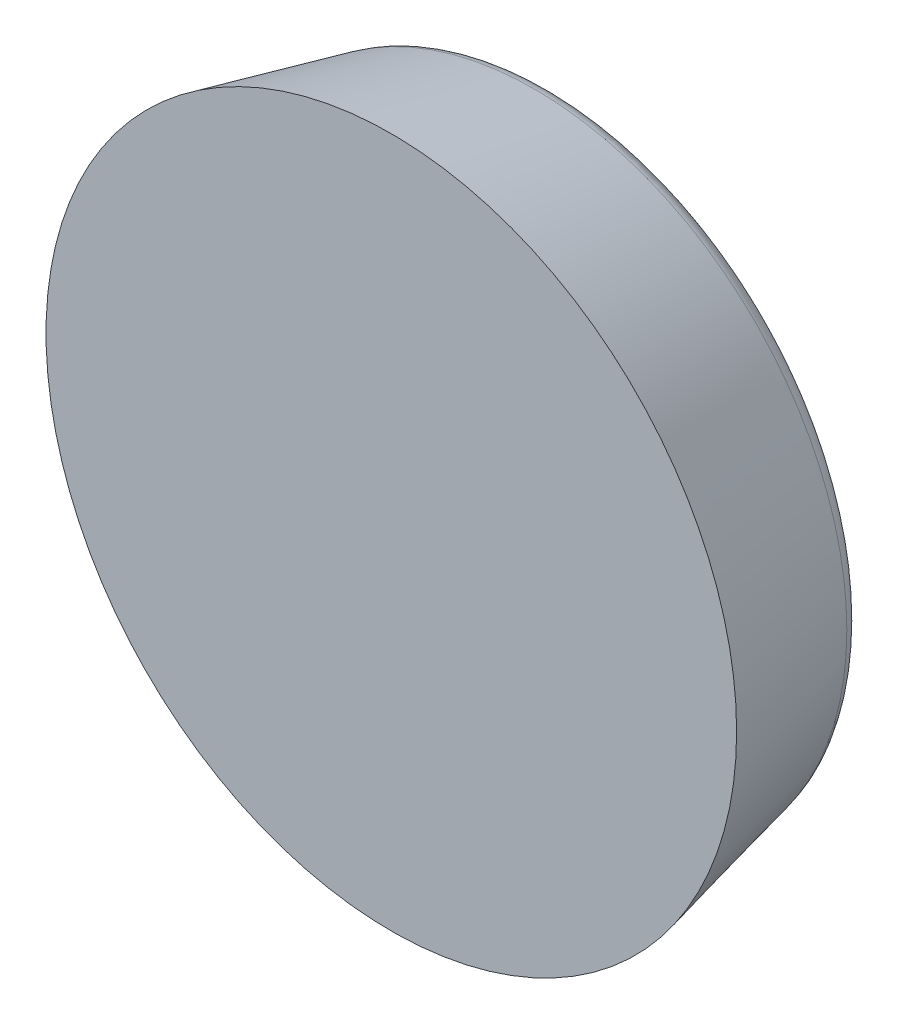
ISO-10303-21;
HEADER;
FILE_DESCRIPTION(('STEP AP214'),'2;1');
FILE_NAME('part.step','',(''),(''),'','','');
FILE_SCHEMA(('AUTOMOTIVE_DESIGN { 1 0 10303 214 1 1 1 1 }'));
ENDSEC;
DATA;
#1=APPLICATION_CONTEXT('core data for automotive mechanical design processes');
#2=APPLICATION_PROTOCOL_DEFINITION('international standard','automotive_design',2000,#1);
#3=PRODUCT_CONTEXT('',#1,'mechanical');
#4=PRODUCT('Part','Part','',(#3));
#5=PRODUCT_RELATED_PRODUCT_CATEGORY('part','',(#4));
#6=PRODUCT_DEFINITION_FORMATION('','',#4);
#7=PRODUCT_DEFINITION_CONTEXT('part definition',#1,'design');
#8=PRODUCT_DEFINITION('design','',#6,#7);
#9=PRODUCT_DEFINITION_SHAPE('','',#8);
#10=(LENGTH_UNIT() NAMED_UNIT(*) SI_UNIT(.MILLI.,.METRE.));
#11=(NAMED_UNIT(*) PLANE_ANGLE_UNIT() SI_UNIT($,.RADIAN.));
#12=(NAMED_UNIT(*) SI_UNIT($,.STERADIAN.) SOLID_ANGLE_UNIT());
#13=UNCERTAINTY_MEASURE_WITH_UNIT(LENGTH_MEASURE(1.E-05),#10,'distance_accuracy_value','');
#14=(GEOMETRIC_REPRESENTATION_CONTEXT(3) GLOBAL_UNCERTAINTY_ASSIGNED_CONTEXT((#13)) GLOBAL_UNIT_ASSIGNED_CONTEXT((#10,
#11,#12)) REPRESENTATION_CONTEXT('',''));
#15=CARTESIAN_POINT('',(0.,0.,0.));
#16=DIRECTION('',(0.,0.,1.));
#17=DIRECTION('',(1.,0.,0.));
#18=AXIS2_PLACEMENT_3D('',#15,#16,#17);
#19=CARTESIAN_POINT('',(0.,0.,0.));
#20=DIRECTION('',(0.,0.,1.));
#21=DIRECTION('',(1.,0.,0.));
#22=AXIS2_PLACEMENT_3D('',#19,#20,#21);
#23=CONICAL_SURFACE('',#22,15.,0.226892802759263);
#24=CARTESIAN_POINT('',(0.,0.,-6.22495105434387));
#25=DIRECTION('',(0.,0.,1.));
#26=DIRECTION('',(1.,0.,0.));
#27=AXIS2_PLACEMENT_3D('',#24,#25,#26);
#28=CIRCLE('',#27,13.5628568102385);
#29=CARTESIAN_POINT('',(13.5628568102385,0.,-6.22495105434387));
#30=VERTEX_POINT('',#29);
#31=EDGE_CURVE('E75',#30,#30,#28,.T.);
#32=ORIENTED_EDGE('',*,*,#31,.T.);
#33=EDGE_LOOP('',(#32));
#34=FACE_BOUND('',#33,.T.);
#35=CARTESIAN_POINT('',(0.,0.,0.));
#36=DIRECTION('',(0.,0.,1.));
#37=DIRECTION('',(1.,0.,0.));
#38=AXIS2_PLACEMENT_3D('',#35,#36,#37);
#39=CIRCLE('',#38,15.);
#40=CARTESIAN_POINT('',(15.,0.,0.));
#41=VERTEX_POINT('',#40);
#42=EDGE_CURVE('E226',#41,#41,#39,.T.);
#43=ORIENTED_EDGE('',*,*,#42,.F.);
#44=EDGE_LOOP('',(#43));
#45=FACE_BOUND('',#44,.T.);
#46=ADVANCED_FACE('F66',(#34,#45),#23,.T.);
#47=CARTESIAN_POINT('',(0.,0.,-7.));
#48=DIRECTION('',(0.,0.,1.));
#49=DIRECTION('',(1.,0.,0.));
#50=AXIS2_PLACEMENT_3D('',#47,#48,#49);
#51=PLANE('',#50);
#52=CARTESIAN_POINT('',(0.,0.,-7.));
#53=DIRECTION('',(0.,0.,1.));
#54=DIRECTION('',(1.,0.,0.));
#55=AXIS2_PLACEMENT_3D('',#52,#53,#54);
#56=CIRCLE('',#55,12.5884867454532);
#57=CARTESIAN_POINT('',(12.5884867454532,0.,-7.));
#58=VERTEX_POINT('',#57);
#59=EDGE_CURVE('E12',#58,#58,#56,.F.);
#60=ORIENTED_EDGE('',*,*,#59,.T.);
#61=EDGE_LOOP('',(#60));
#62=FACE_BOUND('',#61,.T.);
#63=CARTESIAN_POINT('',(0.,0.,-7.));
#64=DIRECTION('',(0.,0.,1.));
#65=DIRECTION('',(1.,0.,0.));
#66=AXIS2_PLACEMENT_3D('',#63,#64,#65);
#67=CIRCLE('',#66,11.);
#68=CARTESIAN_POINT('',(11.,0.,-7.));
#69=VERTEX_POINT('',#68);
#70=EDGE_CURVE('E234',#69,#69,#67,.T.);
#71=ORIENTED_EDGE('',*,*,#70,.T.);
#72=EDGE_LOOP('',(#71));
#73=FACE_BOUND('',#72,.T.);
#74=ADVANCED_FACE('F257',(#62,#73),#51,.F.);
#75=CARTESIAN_POINT('',(0.,0.,0.));
#76=DIRECTION('',(0.,0.,1.));
#77=DIRECTION('',(1.,0.,0.));
#78=AXIS2_PLACEMENT_3D('',#75,#76,#77);
#79=PLANE('',#78);
#80=ORIENTED_EDGE('',*,*,#42,.T.);
#81=EDGE_LOOP('',(#80));
#82=FACE_BOUND('',#81,.T.);
#83=ADVANCED_FACE('F262',(#82),#79,.T.);
#84=CARTESIAN_POINT('',(0.,0.,-4.));
#85=DIRECTION('',(0.,0.,-1.));
#86=DIRECTION('',(-1.,0.,0.));
#87=AXIS2_PLACEMENT_3D('',#84,#85,#86);
#88=CYLINDRICAL_SURFACE('',#87,10.);
#89=CARTESIAN_POINT('',(0.,0.,-6.));
#90=DIRECTION('',(0.,0.,1.));
#91=DIRECTION('',(1.,0.,0.));
#92=AXIS2_PLACEMENT_3D('',#89,#90,#91);
#93=CIRCLE('',#92,10.);
#94=CARTESIAN_POINT('',(10.,0.,-6.));
#95=VERTEX_POINT('',#94);
#96=EDGE_CURVE('E230',#95,#95,#93,.F.);
#97=ORIENTED_EDGE('',*,*,#96,.T.);
#98=EDGE_LOOP('',(#97));
#99=FACE_BOUND('',#98,.T.);
#100=CARTESIAN_POINT('',(0.,0.,-4.));
#101=DIRECTION('',(0.,0.,-1.));
#102=DIRECTION('',(-1.,0.,0.));
#103=AXIS2_PLACEMENT_3D('',#100,#101,#102);
#104=CIRCLE('',#103,10.);
#105=CARTESIAN_POINT('',(-10.,0.,-4.));
#106=VERTEX_POINT('',#105);
#107=EDGE_CURVE('E207',#106,#106,#104,.T.);
#108=ORIENTED_EDGE('',*,*,#107,.F.);
#109=EDGE_LOOP('',(#108));
#110=FACE_BOUND('',#109,.T.);
#111=ADVANCED_FACE('F267',(#99,#110),#88,.F.);
#112=CARTESIAN_POINT('',(0.,0.,-4.));
#113=DIRECTION('',(0.,0.,-1.));
#114=DIRECTION('',(-1.,0.,0.));
#115=AXIS2_PLACEMENT_3D('',#112,#113,#114);
#116=PLANE('',#115);
#117=CARTESIAN_POINT('',(0.,0.,-4.));
#118=DIRECTION('',(0.,0.,-1.));
#119=DIRECTION('',(-1.,0.,0.));
#120=AXIS2_PLACEMENT_3D('',#117,#118,#119);
#121=CIRCLE('',#120,6.5);
#122=CARTESIAN_POINT('',(-6.18465843842649,2.,-4.));
#123=VERTEX_POINT('',#122);
#124=CARTESIAN_POINT('',(6.18465843842649,2.,-4.));
#125=VERTEX_POINT('',#124);
#126=EDGE_CURVE('E82',#123,#125,#121,.T.);
#127=ORIENTED_EDGE('',*,*,#126,.F.);
#128=DIRECTION('',(-1.,0.,0.));
#129=VECTOR('',#128,1.);
#130=CARTESIAN_POINT('',(-6.18465843842649,2.,-4.));
#131=LINE('',#130,#129);
#132=CARTESIAN_POINT('',(-8.5,2.,-4.));
#133=VERTEX_POINT('',#132);
#134=EDGE_CURVE('E200',#123,#133,#131,.T.);
#135=ORIENTED_EDGE('',*,*,#134,.T.);
#136=DIRECTION('',(0.,1.,0.));
#137=VECTOR('',#136,1.);
#138=CARTESIAN_POINT('',(-8.5,-2.,-4.));
#139=LINE('',#138,#137);
#140=CARTESIAN_POINT('',(-8.5,-2.,-4.));
#141=VERTEX_POINT('',#140);
#142=EDGE_CURVE('E197',#141,#133,#139,.T.);
#143=ORIENTED_EDGE('',*,*,#142,.F.);
#144=DIRECTION('',(-1.,0.,0.));
#145=VECTOR('',#144,1.);
#146=CARTESIAN_POINT('',(-6.18465843842649,-2.,-4.));
#147=LINE('',#146,#145);
#148=CARTESIAN_POINT('',(-6.18465843842649,-2.,-4.));
#149=VERTEX_POINT('',#148);
#150=EDGE_CURVE('E145',#149,#141,#147,.T.);
#151=ORIENTED_EDGE('',*,*,#150,.F.);
#152=CARTESIAN_POINT('',(0.,0.,-4.));
#153=DIRECTION('',(0.,0.,-1.));
#154=DIRECTION('',(-1.,0.,0.));
#155=AXIS2_PLACEMENT_3D('',#152,#153,#154);
#156=CIRCLE('',#155,6.5);
#157=CARTESIAN_POINT('',(6.18465843842649,-2.,-4.));
#158=VERTEX_POINT('',#157);
#159=EDGE_CURVE('E191',#158,#149,#156,.T.);
#160=ORIENTED_EDGE('',*,*,#159,.F.);
#161=DIRECTION('',(-1.,0.,0.));
#162=VECTOR('',#161,1.);
#163=CARTESIAN_POINT('',(8.5,-2.,-4.));
#164=LINE('',#163,#162);
#165=CARTESIAN_POINT('',(8.5,-2.,-4.));
#166=VERTEX_POINT('',#165);
#167=EDGE_CURVE('E187',#166,#158,#164,.T.);
#168=ORIENTED_EDGE('',*,*,#167,.F.);
#169=DIRECTION('',(0.,1.,0.));
#170=VECTOR('',#169,1.);
#171=CARTESIAN_POINT('',(8.5,-2.,-4.));
#172=LINE('',#171,#170);
#173=CARTESIAN_POINT('',(8.5,2.,-4.));
#174=VERTEX_POINT('',#173);
#175=EDGE_CURVE('E183',#166,#174,#172,.T.);
#176=ORIENTED_EDGE('',*,*,#175,.T.);
#177=DIRECTION('',(-1.,0.,0.));
#178=VECTOR('',#177,1.);
#179=CARTESIAN_POINT('',(8.5,2.,-4.));
#180=LINE('',#179,#178);
#181=EDGE_CURVE('E178',#174,#125,#180,.T.);
#182=ORIENTED_EDGE('',*,*,#181,.T.);
#183=EDGE_LOOP('',(#127,#135,#143,#151,#160,#168,#176,#182));
#184=FACE_BOUND('',#183,.T.);
#185=ORIENTED_EDGE('',*,*,#107,.T.);
#186=EDGE_LOOP('',(#185));
#187=FACE_BOUND('',#186,.T.);
#188=ADVANCED_FACE('F253',(#184,#187),#116,.T.);
#189=CARTESIAN_POINT('',(0.,0.,-6.));
#190=DIRECTION('',(0.,0.,1.));
#191=DIRECTION('',(1.,0.,0.));
#192=AXIS2_PLACEMENT_3D('',#189,#190,#191);
#193=TOROIDAL_SURFACE('',#192,11.,1.);
#194=ORIENTED_EDGE('',*,*,#70,.F.);
#195=EDGE_LOOP('',(#194));
#196=FACE_BOUND('',#195,.T.);
#197=ORIENTED_EDGE('',*,*,#96,.F.);
#198=EDGE_LOOP('',(#197));
#199=FACE_BOUND('',#198,.T.);
#200=ADVANCED_FACE('F245',(#196,#199),#193,.T.);
#201=CARTESIAN_POINT('',(0.,0.,-6.));
#202=DIRECTION('',(0.,0.,1.));
#203=DIRECTION('',(1.,0.,0.));
#204=AXIS2_PLACEMENT_3D('',#201,#202,#203);
#205=TOROIDAL_SURFACE('',#204,12.5884867454532,1.);
#206=ORIENTED_EDGE('',*,*,#59,.F.);
#207=EDGE_LOOP('',(#206));
#208=FACE_BOUND('',#207,.T.);
#209=ORIENTED_EDGE('',*,*,#31,.F.);
#210=EDGE_LOOP('',(#209));
#211=FACE_BOUND('',#210,.T.);
#212=ADVANCED_FACE('F68',(#208,#211),#205,.T.);
#213=CARTESIAN_POINT('',(0.,0.,-0.5));
#214=DIRECTION('',(0.,0.,-1.));
#215=DIRECTION('',(-1.,0.,0.));
#216=AXIS2_PLACEMENT_3D('',#213,#214,#215);
#217=CYLINDRICAL_SURFACE('',#216,6.5);
#218=ORIENTED_EDGE('',*,*,#126,.T.);
#219=DIRECTION('',(0.,0.,-1.));
#220=VECTOR('',#219,1.);
#221=CARTESIAN_POINT('',(6.18465843842649,2.,-0.5));
#222=LINE('',#221,#220);
#223=CARTESIAN_POINT('',(6.18465843842649,2.,-0.5));
#224=VERTEX_POINT('',#223);
#225=EDGE_CURVE('E175',#224,#125,#222,.T.);
#226=ORIENTED_EDGE('',*,*,#225,.F.);
#227=CARTESIAN_POINT('',(0.,0.,-0.5));
#228=DIRECTION('',(0.,0.,-1.));
#229=DIRECTION('',(-1.,0.,0.));
#230=AXIS2_PLACEMENT_3D('',#227,#228,#229);
#231=CIRCLE('',#230,6.5);
#232=CARTESIAN_POINT('',(-6.18465843842649,2.,-0.5));
#233=VERTEX_POINT('',#232);
#234=EDGE_CURVE('E204',#233,#224,#231,.T.);
#235=ORIENTED_EDGE('',*,*,#234,.F.);
#236=DIRECTION('',(0.,0.,-1.));
#237=VECTOR('',#236,1.);
#238=CARTESIAN_POINT('',(-6.18465843842649,2.,-0.5));
#239=LINE('',#238,#237);
#240=EDGE_CURVE('E90',#233,#123,#239,.T.);
#241=ORIENTED_EDGE('',*,*,#240,.T.);
#242=EDGE_LOOP('',(#218,#226,#235,#241));
#243=FACE_BOUND('',#242,.T.);
#244=ADVANCED_FACE('F244',(#243),#217,.F.);
#245=CARTESIAN_POINT('',(-6.18465843842649,2.,-0.5));
#246=DIRECTION('',(0.,-1.,0.));
#247=DIRECTION('',(0.,0.,-1.));
#248=AXIS2_PLACEMENT_3D('',#245,#246,#247);
#249=PLANE('',#248);
#250=ORIENTED_EDGE('',*,*,#134,.F.);
#251=ORIENTED_EDGE('',*,*,#240,.F.);
#252=DIRECTION('',(-1.,0.,0.));
#253=VECTOR('',#252,1.);
#254=CARTESIAN_POINT('',(-6.18465843842649,2.,-0.5));
#255=LINE('',#254,#253);
#256=CARTESIAN_POINT('',(-8.5,2.,-0.5));
#257=VERTEX_POINT('',#256);
#258=EDGE_CURVE('E159',#233,#257,#255,.T.);
#259=ORIENTED_EDGE('',*,*,#258,.T.);
#260=DIRECTION('',(0.,0.,-1.));
#261=VECTOR('',#260,1.);
#262=CARTESIAN_POINT('',(-8.5,2.,-0.5));
#263=LINE('',#262,#261);
#264=EDGE_CURVE('E150',#257,#133,#263,.T.);
#265=ORIENTED_EDGE('',*,*,#264,.T.);
#266=EDGE_LOOP('',(#250,#251,#259,#265));
#267=FACE_BOUND('',#266,.T.);
#268=ADVANCED_FACE('F251',(#267),#249,.T.);
#269=CARTESIAN_POINT('',(-8.5,-2.,-0.5));
#270=DIRECTION('',(-1.,0.,0.));
#271=DIRECTION('',(0.,0.,1.));
#272=AXIS2_PLACEMENT_3D('',#269,#270,#271);
#273=PLANE('',#272);
#274=ORIENTED_EDGE('',*,*,#142,.T.);
#275=ORIENTED_EDGE('',*,*,#264,.F.);
#276=DIRECTION('',(0.,1.,0.));
#277=VECTOR('',#276,1.);
#278=CARTESIAN_POINT('',(-8.5,-2.,-0.5));
#279=LINE('',#278,#277);
#280=CARTESIAN_POINT('',(-8.5,-2.,-0.5));
#281=VERTEX_POINT('',#280);
#282=EDGE_CURVE('E155',#281,#257,#279,.T.);
#283=ORIENTED_EDGE('',*,*,#282,.F.);
#284=DIRECTION('',(0.,0.,-1.));
#285=VECTOR('',#284,1.);
#286=CARTESIAN_POINT('',(-8.5,-2.,-0.5));
#287=LINE('',#286,#285);
#288=EDGE_CURVE('E138',#281,#141,#287,.T.);
#289=ORIENTED_EDGE('',*,*,#288,.T.);
#290=EDGE_LOOP('',(#274,#275,#283,#289));
#291=FACE_BOUND('',#290,.T.);
#292=ADVANCED_FACE('F156',(#291),#273,.F.);
#293=CARTESIAN_POINT('',(-6.18465843842649,-2.,-0.5));
#294=DIRECTION('',(0.,-1.,0.));
#295=DIRECTION('',(0.,0.,-1.));
#296=AXIS2_PLACEMENT_3D('',#293,#294,#295);
#297=PLANE('',#296);
#298=ORIENTED_EDGE('',*,*,#150,.T.);
#299=ORIENTED_EDGE('',*,*,#288,.F.);
#300=DIRECTION('',(-1.,0.,0.));
#301=VECTOR('',#300,1.);
#302=CARTESIAN_POINT('',(-6.18465843842649,-2.,-0.5));
#303=LINE('',#302,#301);
#304=CARTESIAN_POINT('',(-6.18465843842649,-2.,-0.5));
#305=VERTEX_POINT('',#304);
#306=EDGE_CURVE('E142',#305,#281,#303,.T.);
#307=ORIENTED_EDGE('',*,*,#306,.F.);
#308=DIRECTION('',(0.,0.,-1.));
#309=VECTOR('',#308,1.);
#310=CARTESIAN_POINT('',(-6.18465843842649,-2.,-0.5));
#311=LINE('',#310,#309);
#312=EDGE_CURVE('E151',#305,#149,#311,.T.);
#313=ORIENTED_EDGE('',*,*,#312,.T.);
#314=EDGE_LOOP('',(#298,#299,#307,#313));
#315=FACE_BOUND('',#314,.T.);
#316=ADVANCED_FACE('F140',(#315),#297,.F.);
#317=CARTESIAN_POINT('',(0.,0.,-0.5));
#318=DIRECTION('',(0.,0.,-1.));
#319=DIRECTION('',(-1.,0.,0.));
#320=AXIS2_PLACEMENT_3D('',#317,#318,#319);
#321=CYLINDRICAL_SURFACE('',#320,6.5);
#322=ORIENTED_EDGE('',*,*,#159,.T.);
#323=ORIENTED_EDGE('',*,*,#312,.F.);
#324=CARTESIAN_POINT('',(0.,0.,-0.5));
#325=DIRECTION('',(0.,0.,-1.));
#326=DIRECTION('',(-1.,0.,0.));
#327=AXIS2_PLACEMENT_3D('',#324,#325,#326);
#328=CIRCLE('',#327,6.5);
#329=CARTESIAN_POINT('',(6.18465843842649,-2.,-0.5));
#330=VERTEX_POINT('',#329);
#331=EDGE_CURVE('E165',#330,#305,#328,.T.);
#332=ORIENTED_EDGE('',*,*,#331,.F.);
#333=DIRECTION('',(0.,0.,-1.));
#334=VECTOR('',#333,1.);
#335=CARTESIAN_POINT('',(6.18465843842649,-2.,-0.5));
#336=LINE('',#335,#334);
#337=EDGE_CURVE('E212',#330,#158,#336,.T.);
#338=ORIENTED_EDGE('',*,*,#337,.T.);
#339=EDGE_LOOP('',(#322,#323,#332,#338));
#340=FACE_BOUND('',#339,.T.);
#341=ADVANCED_FACE('F287',(#340),#321,.F.);
#342=CARTESIAN_POINT('',(8.5,-2.,-0.5));
#343=DIRECTION('',(0.,-1.,0.));
#344=DIRECTION('',(0.,0.,-1.));
#345=AXIS2_PLACEMENT_3D('',#342,#343,#344);
#346=PLANE('',#345);
#347=ORIENTED_EDGE('',*,*,#167,.T.);
#348=ORIENTED_EDGE('',*,*,#337,.F.);
#349=DIRECTION('',(-1.,0.,0.));
#350=VECTOR('',#349,1.);
#351=CARTESIAN_POINT('',(8.5,-2.,-0.5));
#352=LINE('',#351,#350);
#353=CARTESIAN_POINT('',(8.5,-2.,-0.5));
#354=VERTEX_POINT('',#353);
#355=EDGE_CURVE('E169',#354,#330,#352,.T.);
#356=ORIENTED_EDGE('',*,*,#355,.F.);
#357=DIRECTION('',(0.,0.,-1.));
#358=VECTOR('',#357,1.);
#359=CARTESIAN_POINT('',(8.5,-2.,-0.5));
#360=LINE('',#359,#358);
#361=EDGE_CURVE('E215',#354,#166,#360,.T.);
#362=ORIENTED_EDGE('',*,*,#361,.T.);
#363=EDGE_LOOP('',(#347,#348,#356,#362));
#364=FACE_BOUND('',#363,.T.);
#365=ADVANCED_FACE('F283',(#364),#346,.F.);
#366=CARTESIAN_POINT('',(8.5,-2.,-0.5));
#367=DIRECTION('',(-1.,0.,0.));
#368=DIRECTION('',(0.,0.,1.));
#369=AXIS2_PLACEMENT_3D('',#366,#367,#368);
#370=PLANE('',#369);
#371=ORIENTED_EDGE('',*,*,#175,.F.);
#372=ORIENTED_EDGE('',*,*,#361,.F.);
#373=DIRECTION('',(0.,1.,0.));
#374=VECTOR('',#373,1.);
#375=CARTESIAN_POINT('',(8.5,-2.,-0.5));
#376=LINE('',#375,#374);
#377=CARTESIAN_POINT('',(8.5,2.,-0.5));
#378=VERTEX_POINT('',#377);
#379=EDGE_CURVE('E323',#354,#378,#376,.T.);
#380=ORIENTED_EDGE('',*,*,#379,.T.);
#381=DIRECTION('',(0.,0.,-1.));
#382=VECTOR('',#381,1.);
#383=CARTESIAN_POINT('',(8.5,2.,-0.5));
#384=LINE('',#383,#382);
#385=EDGE_CURVE('E218',#378,#174,#384,.T.);
#386=ORIENTED_EDGE('',*,*,#385,.T.);
#387=EDGE_LOOP('',(#371,#372,#380,#386));
#388=FACE_BOUND('',#387,.T.);
#389=ADVANCED_FACE('F280',(#388),#370,.T.);
#390=CARTESIAN_POINT('',(8.5,2.,-0.5));
#391=DIRECTION('',(0.,-1.,0.));
#392=DIRECTION('',(0.,0.,-1.));
#393=AXIS2_PLACEMENT_3D('',#390,#391,#392);
#394=PLANE('',#393);
#395=ORIENTED_EDGE('',*,*,#181,.F.);
#396=ORIENTED_EDGE('',*,*,#385,.F.);
#397=DIRECTION('',(-1.,0.,0.));
#398=VECTOR('',#397,1.);
#399=CARTESIAN_POINT('',(8.5,2.,-0.5));
#400=LINE('',#399,#398);
#401=EDGE_CURVE('E122',#378,#224,#400,.T.);
#402=ORIENTED_EDGE('',*,*,#401,.T.);
#403=ORIENTED_EDGE('',*,*,#225,.T.);
#404=EDGE_LOOP('',(#395,#396,#402,#403));
#405=FACE_BOUND('',#404,.T.);
#406=ADVANCED_FACE('F277',(#405),#394,.T.);
#407=CARTESIAN_POINT('',(0.,0.,-0.5));
#408=DIRECTION('',(0.,0.,-1.));
#409=DIRECTION('',(-1.,0.,0.));
#410=AXIS2_PLACEMENT_3D('',#407,#408,#409);
#411=PLANE('',#410);
#412=CARTESIAN_POINT('',(0.,0.,-0.5));
#413=DIRECTION('',(0.,0.,-1.));
#414=DIRECTION('',(-1.,0.,0.));
#415=AXIS2_PLACEMENT_3D('',#412,#413,#414);
#416=CIRCLE('',#415,2.);
#417=CARTESIAN_POINT('',(-2.,0.,-0.5));
#418=VERTEX_POINT('',#417);
#419=EDGE_CURVE('E179',#418,#418,#416,.T.);
#420=ORIENTED_EDGE('',*,*,#419,.F.);
#421=EDGE_LOOP('',(#420));
#422=FACE_BOUND('',#421,.T.);
#423=ORIENTED_EDGE('',*,*,#234,.T.);
#424=ORIENTED_EDGE('',*,*,#401,.F.);
#425=ORIENTED_EDGE('',*,*,#379,.F.);
#426=ORIENTED_EDGE('',*,*,#355,.T.);
#427=ORIENTED_EDGE('',*,*,#331,.T.);
#428=ORIENTED_EDGE('',*,*,#306,.T.);
#429=ORIENTED_EDGE('',*,*,#282,.T.);
#430=ORIENTED_EDGE('',*,*,#258,.F.);
#431=EDGE_LOOP('',(#423,#424,#425,#426,#427,#428,#429,#430));
#432=FACE_BOUND('',#431,.T.);
#433=ADVANCED_FACE('F162',(#422,#432),#411,.T.);
#434=CARTESIAN_POINT('',(0.,0.,-0.5));
#435=DIRECTION('',(0.,0.,-1.));
#436=DIRECTION('',(-1.,0.,0.));
#437=AXIS2_PLACEMENT_3D('',#434,#435,#436);
#438=CYLINDRICAL_SURFACE('',#437,2.);
#439=ORIENTED_EDGE('',*,*,#419,.T.);
#440=EDGE_LOOP('',(#439));
#441=FACE_BOUND('',#440,.T.);
#442=CARTESIAN_POINT('',(0.,0.,-4.));
#443=DIRECTION('',(0.,0.,-1.));
#444=DIRECTION('',(-1.,0.,0.));
#445=AXIS2_PLACEMENT_3D('',#442,#443,#444);
#446=CIRCLE('',#445,2.);
#447=CARTESIAN_POINT('',(-2.,0.,-4.));
#448=VERTEX_POINT('',#447);
#449=EDGE_CURVE('E313',#448,#448,#446,.T.);
#450=ORIENTED_EDGE('',*,*,#449,.F.);
#451=EDGE_LOOP('',(#450));
#452=FACE_BOUND('',#451,.T.);
#453=ADVANCED_FACE('F300',(#441,#452),#438,.T.);
#454=ORIENTED_EDGE('',*,*,#449,.T.);
#455=EDGE_LOOP('',(#454));
#456=FACE_BOUND('',#455,.T.);
#457=ADVANCED_FACE('F275',(#456),#116,.T.);
#458=CLOSED_SHELL('',(#46,#74,#83,#111,#188,#200,#212,#244,#268,#292,#316,#341,#365,#389,#406,
#433,#453,#457));
#459=MANIFOLD_SOLID_BREP('B2',#458);
#460=ADVANCED_BREP_SHAPE_REPRESENTATION('',(#18,#459),#14);
#461=SHAPE_DEFINITION_REPRESENTATION(#9,#460);
ENDSEC;
END-ISO-10303-21;
